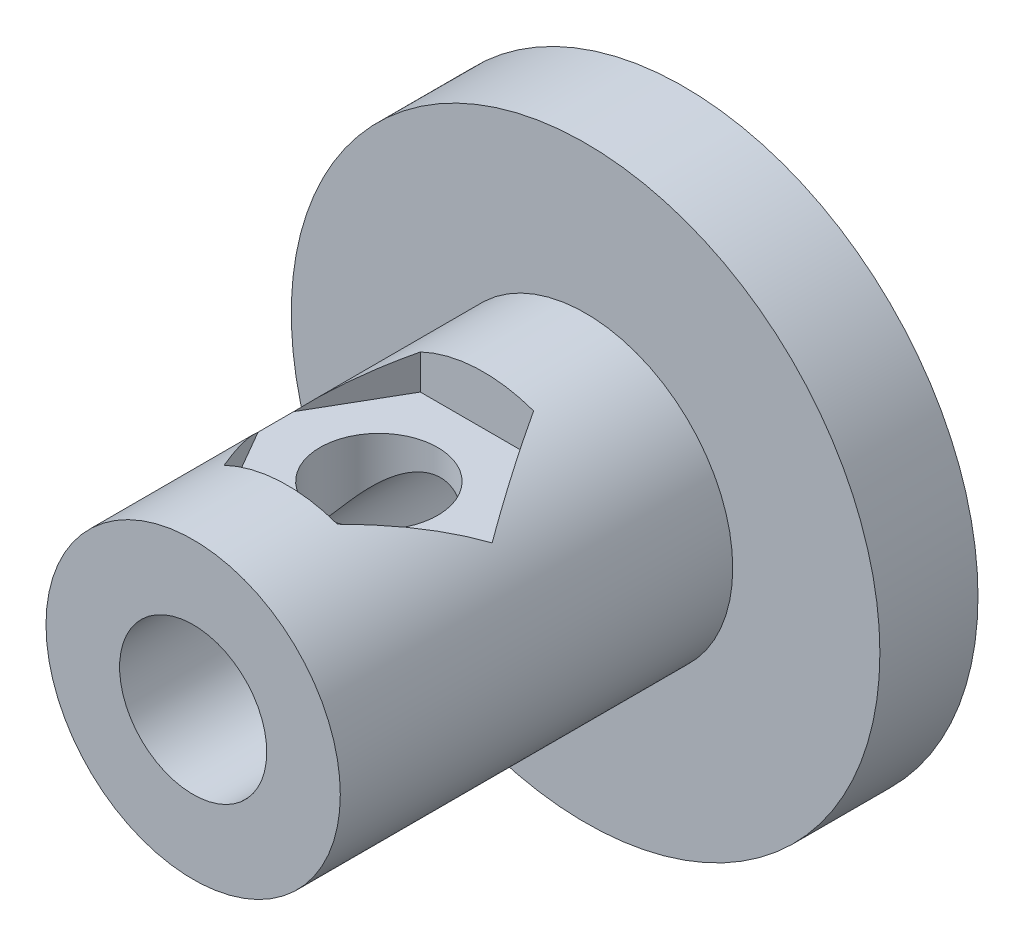
ISO-10303-21;
HEADER;
FILE_DESCRIPTION(('STEP AP214'),'2;1');
FILE_NAME('part.step','',(''),(''),'','','');
FILE_SCHEMA(('AUTOMOTIVE_DESIGN { 1 0 10303 214 1 1 1 1 }'));
ENDSEC;
DATA;
#1=APPLICATION_CONTEXT('core data for automotive mechanical design processes');
#2=APPLICATION_PROTOCOL_DEFINITION('international standard','automotive_design',2000,#1);
#3=PRODUCT_CONTEXT('',#1,'mechanical');
#4=PRODUCT('Part','Part','',(#3));
#5=PRODUCT_RELATED_PRODUCT_CATEGORY('part','',(#4));
#6=PRODUCT_DEFINITION_FORMATION('','',#4);
#7=PRODUCT_DEFINITION_CONTEXT('part definition',#1,'design');
#8=PRODUCT_DEFINITION('design','',#6,#7);
#9=PRODUCT_DEFINITION_SHAPE('','',#8);
#10=(LENGTH_UNIT() NAMED_UNIT(*) SI_UNIT(.MILLI.,.METRE.));
#11=(NAMED_UNIT(*) PLANE_ANGLE_UNIT() SI_UNIT($,.RADIAN.));
#12=(NAMED_UNIT(*) SI_UNIT($,.STERADIAN.) SOLID_ANGLE_UNIT());
#13=UNCERTAINTY_MEASURE_WITH_UNIT(LENGTH_MEASURE(1.E-05),#10,'distance_accuracy_value','');
#14=(GEOMETRIC_REPRESENTATION_CONTEXT(3) GLOBAL_UNCERTAINTY_ASSIGNED_CONTEXT((#13)) GLOBAL_UNIT_ASSIGNED_CONTEXT((#10,
#11,#12)) REPRESENTATION_CONTEXT('',''));
#15=CARTESIAN_POINT('',(0.,0.,0.));
#16=DIRECTION('',(0.,0.,1.));
#17=DIRECTION('',(1.,0.,0.));
#18=AXIS2_PLACEMENT_3D('',#15,#16,#17);
#19=CARTESIAN_POINT('',(-0.135733681298919,-6.001,6.07836587743603));
#20=DIRECTION('',(0.,1.,0.));
#21=DIRECTION('',(0.,0.,1.));
#22=AXIS2_PLACEMENT_3D('',#19,#20,#21);
#23=CYLINDRICAL_SURFACE('',#22,1.2);
#24=CARTESIAN_POINT('',(-0.135733681298919,1.4938461660295,7.27836587743603));
#25=CARTESIAN_POINT('',(-0.0796270431611258,1.49894260178293,7.27836417352178));
#26=CARTESIAN_POINT('',(-0.0232163721366961,1.50085628885863,7.27440524520705));
#27=CARTESIAN_POINT('',(0.0883573269891862,1.49843640460588,7.25860402794741));
#28=CARTESIAN_POINT('',(0.143519773244522,1.4940999784002,7.24675813778859));
#29=CARTESIAN_POINT('',(0.250718408704075,1.47988325647148,7.21580018480276));
#30=CARTESIAN_POINT('',(0.302767028580177,1.47002689581702,7.19671960700027));
#31=CARTESIAN_POINT('',(0.402864810686515,1.44580638299001,7.15210638672446));
#32=CARTESIAN_POINT('',(0.450912884782622,1.43144100941717,7.12657199640943));
#33=CARTESIAN_POINT('',(0.545502314233019,1.39825299314072,7.06792521180374));
#34=CARTESIAN_POINT('',(0.591706997881074,1.37918999749919,7.03440954745417));
#35=CARTESIAN_POINT('',(0.678358642116099,1.33870133167904,6.96179930978559));
#36=CARTESIAN_POINT('',(0.718800005092257,1.31727339991542,6.92269938555684));
#37=CARTESIAN_POINT('',(0.801168646307639,1.26918542192973,6.83118121998646));
#38=CARTESIAN_POINT('',(0.841769238515165,1.2423374847902,6.77766430015797));
#39=CARTESIAN_POINT('',(0.913818606114568,1.19033826866163,6.6639982651824));
#40=CARTESIAN_POINT('',(0.945269302764588,1.16518663434304,6.60385054600668));
#41=CARTESIAN_POINT('',(0.991706748077785,1.12570626065198,6.49258986852545));
#42=CARTESIAN_POINT('',(1.0088341465741,1.11022957091165,6.4427857967973));
#43=CARTESIAN_POINT('',(1.03656183262505,1.08439005004334,6.34016021455954));
#44=CARTESIAN_POINT('',(1.04717602195245,1.07401633659945,6.28734539555484));
#45=CARTESIAN_POINT('',(1.06126234052719,1.06010827064272,6.17930385385326));
#46=CARTESIAN_POINT('',(1.06466539077231,1.05664008842768,6.12405893261371));
#47=CARTESIAN_POINT('',(1.06379216795507,1.057518945483,6.01368935658569));
#48=CARTESIAN_POINT('',(1.05951549115051,1.06186639564046,5.95856470827281));
#49=CARTESIAN_POINT('',(1.04468713562459,1.07643569498428,5.85723285866862));
#50=CARTESIAN_POINT('',(1.03498856327851,1.08585350678512,5.81077356628107));
#51=CARTESIAN_POINT('',(1.0105347559388,1.10864742752818,5.72021528193841));
#52=CARTESIAN_POINT('',(0.995774301917683,1.12202761991209,5.67611878060006));
#53=CARTESIAN_POINT('',(0.95272557018395,1.15908637799158,5.56829203053582));
#54=CARTESIAN_POINT('',(0.921400399034858,1.18448968147715,5.50636531939323));
#55=CARTESIAN_POINT('',(0.849121760624869,1.2373384120762,5.38930385475464));
#56=CARTESIAN_POINT('',(0.808147995358256,1.26478805977987,5.33418379844793));
#57=CARTESIAN_POINT('',(0.716363254925671,1.3189817195393,5.2305486170724));
#58=CARTESIAN_POINT('',(0.665405876424545,1.3457075075952,5.18215278850357));
#59=CARTESIAN_POINT('',(0.55462367402599,1.39500917933499,5.09430317677244));
#60=CARTESIAN_POINT('',(0.494818886351214,1.41759418812971,5.05482968544402));
#61=CARTESIAN_POINT('',(0.382425092871546,1.45132312201442,4.99459289271979));
#62=CARTESIAN_POINT('',(0.331457729004935,1.46390901102652,4.97161252934724));
#63=CARTESIAN_POINT('',(0.225900603413754,1.48386162132401,4.93277645022079));
#64=CARTESIAN_POINT('',(0.171313482052747,1.4912321020697,4.9169156054748));
#65=CARTESIAN_POINT('',(0.0596908357925977,1.4998608502241,4.89300506578695));
#66=CARTESIAN_POINT('',(0.00264505945625973,1.50109038773345,4.88499222717047));
#67=CARTESIAN_POINT('',(-0.111765704155303,1.49692440306144,4.87723675182094));
#68=CARTESIAN_POINT('',(-0.169130650460284,1.49152971251995,4.87749307703638));
#69=CARTESIAN_POINT('',(-0.278011062182345,1.47496344063762,4.88567320688333));
#70=CARTESIAN_POINT('',(-0.329643237476096,1.46425384581075,4.89302241090054));
#71=CARTESIAN_POINT('',(-0.43030434055141,1.43789702554554,4.91394614729815));
#72=CARTESIAN_POINT('',(-0.479332503680097,1.42224835904074,4.92752249708934));
#73=CARTESIAN_POINT('',(-0.577316025997088,1.38551003446642,4.96127988090196));
#74=CARTESIAN_POINT('',(-0.626013982099224,1.36411064478783,4.98186476453753));
#75=CARTESIAN_POINT('',(-0.718844074564227,1.31755988089075,5.02828076548914));
#76=CARTESIAN_POINT('',(-0.762975785621773,1.2924081577074,5.05411237082813));
#77=CARTESIAN_POINT('',(-0.868003450948302,1.22563752055711,5.12464034201224));
#78=CARTESIAN_POINT('',(-0.92583016457828,1.18220820883773,5.17220141351824));
#79=CARTESIAN_POINT('',(-1.03083420045933,1.09187723928378,5.27569699116082));
#80=CARTESIAN_POINT('',(-1.07795308493423,1.04495829861463,5.33167480009543));
#81=CARTESIAN_POINT('',(-1.14101506862213,0.974226860610161,5.42201736250707));
#82=CARTESIAN_POINT('',(-1.16094851101259,0.950315497692979,5.45359324685305));
#83=CARTESIAN_POINT('',(-1.19800171895747,0.903155249523484,5.51890234746066));
#84=CARTESIAN_POINT('',(-1.21511877142524,0.879907020693438,5.55263760094507));
#85=CARTESIAN_POINT('',(-1.24630906813862,0.835136137128139,5.62222188103002));
#86=CARTESIAN_POINT('',(-1.26040198523268,0.813602940688974,5.6580551874583));
#87=CARTESIAN_POINT('',(-1.28542308236089,0.773461878103975,5.73232348819905));
#88=CARTESIAN_POINT('',(-1.29635872829753,0.754847159200216,5.77075207529759));
#89=CARTESIAN_POINT('',(-1.31274680642724,0.725889600112298,5.84236317610499));
#90=CARTESIAN_POINT('',(-1.31886311081675,0.714633707072689,5.87501259358002));
#91=CARTESIAN_POINT('',(-1.32842162734975,0.696707322498565,5.94187826889562));
#92=CARTESIAN_POINT('',(-1.33187224496555,0.690022425373426,5.97608923845027));
#93=CARTESIAN_POINT('',(-1.33579863875836,0.68239592518046,6.04570285109911));
#94=CARTESIAN_POINT('',(-1.33624465053454,0.681511788173277,6.08111393456347));
#95=CARTESIAN_POINT('',(-1.33402329964372,0.685846638759108,6.15148450371083));
#96=CARTESIAN_POINT('',(-1.33135120974466,0.691074893132335,6.1864432222515));
#97=CARTESIAN_POINT('',(-1.32227609115182,0.708305061750922,6.26247869524771));
#98=CARTESIAN_POINT('',(-1.31517167803116,0.721561468821169,6.3031728215692));
#99=CARTESIAN_POINT('',(-1.29743342777126,0.752987459807567,6.38183361836803));
#100=CARTESIAN_POINT('',(-1.28678694240539,0.771174606967282,6.41978991275483));
#101=CARTESIAN_POINT('',(-1.26352589739018,0.808669767504328,6.48985312631392));
#102=CARTESIAN_POINT('',(-1.25116958900284,0.827735359579544,6.52218027507247));
#103=CARTESIAN_POINT('',(-1.22410014151474,0.867268998226592,6.58494883094347));
#104=CARTESIAN_POINT('',(-1.20938514153056,0.887738144771652,6.61538872259336));
#105=CARTESIAN_POINT('',(-1.1618098284645,0.95022472805594,6.70422174962459));
#106=CARTESIAN_POINT('',(-1.12553538296812,0.993293515692343,6.76008105052399));
#107=CARTESIAN_POINT('',(-1.04071884282956,1.08212667062918,6.86967837879692));
#108=CARTESIAN_POINT('',(-0.991423911761685,1.12782869920005,6.92288304173039));
#109=CARTESIAN_POINT('',(-0.882110962947404,1.21521785374912,7.02085173115078));
#110=CARTESIAN_POINT('',(-0.822117345386032,1.25691379013442,7.06563449746782));
#111=CARTESIAN_POINT('',(-0.708722825413131,1.32318688974125,7.13422797985752));
#112=CARTESIAN_POINT('',(-0.657734064304827,1.34938293164666,7.1604571453039));
#113=CARTESIAN_POINT('',(-0.550483352948301,1.39656147977492,7.20591244590148));
#114=CARTESIAN_POINT('',(-0.49422856555008,1.41755093006184,7.22514792470701));
#115=CARTESIAN_POINT('',(-0.387979522565712,1.44982172431515,7.25259885078811));
#116=CARTESIAN_POINT('',(-0.338659009255695,1.46216700855893,7.26216814021328));
#117=CARTESIAN_POINT('',(-0.238221509244758,1.48184536730209,7.27505154906439));
#118=CARTESIAN_POINT('',(-0.187105034780941,1.48917985895289,7.27836743754343));
#119=CARTESIAN_POINT('',(-0.135733681298919,1.4938461660295,7.27836587743603));
#120=B_SPLINE_CURVE_WITH_KNOTS('',3,(#24,#25,#26,#27,#28,#29,#30,#31,#32,#33,#34,#35,#36,#37,
#38,#39,#40,#41,#42,#43,#44,#45,#46,#47,#48,#49,#50,#51,#52,#53,#54,#55,#56,#57,#58,#59,#60,#61,
#62,#63,#64,#65,#66,#67,#68,#69,#70,#71,#72,#73,#74,#75,#76,#77,#78,#79,#80,#81,#82,#83,#84,#85,
#86,#87,#88,#89,#90,#91,#92,#93,#94,#95,#96,#97,#98,#99,#100,#101,#102,#103,#104,#105,#106,#107,
#108,#109,#110,#111,#112,#113,#114,#115,#116,#117,#118,#119),.UNSPECIFIED.,.T.,.F.,(4,2,2,2,2,2,
2,2,2,2,2,2,2,2,2,2,2,2,2,2,2,2,2,2,2,2,2,2,2,2,2,2,2,2,2,2,2,2,2,2,2,2,2,2,2,2,2,4),(0.,
0.168808448998161,0.337694029423268,0.505852910156556,0.674057381093598,0.853949402275628,
1.03401496944917,1.25016973454753,1.46627907952832,1.63038386312898,1.79413715247798,
1.95945215178255,2.12477584235894,2.26939112600298,2.41415596503878,2.63468914918182,
2.85569048624793,3.08021481703249,3.30423825085427,3.47545960433326,3.64655740901309,
3.81845493581203,3.99033088391222,4.14935856300244,4.30843268434886,4.47891543514866,
4.6494140506411,4.90770752421676,5.16737847525468,5.30028864326812,5.43332610613511,
5.56546996216516,5.6972987332417,5.8021833180028,5.90673581415467,6.01232253056436,
6.11806953106349,6.24749254772327,6.37738276626667,6.49575442270615,6.61421993201337,
6.85132049756415,7.10752087428722,7.36314424575934,7.5515762957866,7.73975566500928,
7.89436077223614,8.04892213595462),.UNSPECIFIED.);
#121=CARTESIAN_POINT('',(-0.135733681298919,1.4938461660295,7.27836587743603));
#122=VERTEX_POINT('',#121);
#123=EDGE_CURVE('E132',#122,#122,#120,.T.);
#124=ORIENTED_EDGE('',*,*,#123,.F.);
#125=EDGE_LOOP('',(#124));
#126=FACE_BOUND('',#125,.T.);
#127=CARTESIAN_POINT('',(-0.135733681298919,2.,6.07836587743603));
#128=DIRECTION('',(0.,1.,0.));
#129=DIRECTION('',(0.,0.,1.));
#130=AXIS2_PLACEMENT_3D('',#127,#128,#129);
#131=CIRCLE('',#130,1.2);
#132=CARTESIAN_POINT('',(-0.135733681298919,2.,7.27836587743603));
#133=VERTEX_POINT('',#132);
#134=EDGE_CURVE('E112',#133,#133,#131,.T.);
#135=ORIENTED_EDGE('',*,*,#134,.T.);
#136=EDGE_LOOP('',(#135));
#137=FACE_BOUND('',#136,.T.);
#138=ADVANCED_FACE('F35',(#126,#137),#23,.F.);
#139=CARTESIAN_POINT('',(0.,0.,2.));
#140=DIRECTION('',(0.,0.,1.));
#141=DIRECTION('',(1.,0.,0.));
#142=AXIS2_PLACEMENT_3D('',#139,#140,#141);
#143=PLANE('',#142);
#144=CARTESIAN_POINT('',(0.,0.,2.));
#145=DIRECTION('',(0.,0.,1.));
#146=DIRECTION('',(1.,0.,0.));
#147=AXIS2_PLACEMENT_3D('',#144,#145,#146);
#148=CIRCLE('',#147,6.);
#149=CARTESIAN_POINT('',(6.,0.,2.));
#150=VERTEX_POINT('',#149);
#151=EDGE_CURVE('E284',#150,#150,#148,.T.);
#152=ORIENTED_EDGE('',*,*,#151,.T.);
#153=EDGE_LOOP('',(#152));
#154=FACE_BOUND('',#153,.T.);
#155=CARTESIAN_POINT('',(0.,0.,2.));
#156=DIRECTION('',(0.,0.,1.));
#157=DIRECTION('',(1.,0.,0.));
#158=AXIS2_PLACEMENT_3D('',#155,#156,#157);
#159=CIRCLE('',#158,3.);
#160=CARTESIAN_POINT('',(3.,0.,2.));
#161=VERTEX_POINT('',#160);
#162=EDGE_CURVE('E303',#161,#161,#159,.T.);
#163=ORIENTED_EDGE('',*,*,#162,.F.);
#164=EDGE_LOOP('',(#163));
#165=FACE_BOUND('',#164,.T.);
#166=ADVANCED_FACE('F157',(#154,#165),#143,.T.);
#167=CARTESIAN_POINT('',(0.,0.,0.));
#168=DIRECTION('',(0.,0.,1.));
#169=DIRECTION('',(1.,0.,0.));
#170=AXIS2_PLACEMENT_3D('',#167,#168,#169);
#171=PLANE('',#170);
#172=CARTESIAN_POINT('',(0.,0.,0.));
#173=DIRECTION('',(0.,0.,1.));
#174=DIRECTION('',(1.,0.,0.));
#175=AXIS2_PLACEMENT_3D('',#172,#173,#174);
#176=CIRCLE('',#175,6.);
#177=CARTESIAN_POINT('',(6.,0.,0.));
#178=VERTEX_POINT('',#177);
#179=EDGE_CURVE('E294',#178,#178,#176,.T.);
#180=ORIENTED_EDGE('',*,*,#179,.F.);
#181=EDGE_LOOP('',(#180));
#182=FACE_BOUND('',#181,.T.);
#183=CARTESIAN_POINT('',(0.,0.,0.));
#184=DIRECTION('',(0.,0.,1.));
#185=DIRECTION('',(1.,0.,0.));
#186=AXIS2_PLACEMENT_3D('',#183,#184,#185);
#187=CIRCLE('',#186,1.5);
#188=CARTESIAN_POINT('',(1.5,0.,0.));
#189=VERTEX_POINT('',#188);
#190=EDGE_CURVE('E297',#189,#189,#187,.T.);
#191=ORIENTED_EDGE('',*,*,#190,.T.);
#192=EDGE_LOOP('',(#191));
#193=FACE_BOUND('',#192,.T.);
#194=ADVANCED_FACE('F159',(#182,#193),#171,.F.);
#195=CARTESIAN_POINT('',(0.,0.,2.));
#196=DIRECTION('',(0.,0.,-1.));
#197=DIRECTION('',(-1.,0.,0.));
#198=AXIS2_PLACEMENT_3D('',#195,#196,#197);
#199=CYLINDRICAL_SURFACE('',#198,6.);
#200=ORIENTED_EDGE('',*,*,#151,.F.);
#201=EDGE_LOOP('',(#200));
#202=FACE_BOUND('',#201,.T.);
#203=ORIENTED_EDGE('',*,*,#179,.T.);
#204=EDGE_LOOP('',(#203));
#205=FACE_BOUND('',#204,.T.);
#206=ADVANCED_FACE('F37',(#202,#205),#199,.T.);
#207=CARTESIAN_POINT('',(0.,0.,2.));
#208=DIRECTION('',(0.,0.,-1.));
#209=DIRECTION('',(-1.,0.,0.));
#210=AXIS2_PLACEMENT_3D('',#207,#208,#209);
#211=CYLINDRICAL_SURFACE('',#210,1.5);
#212=ORIENTED_EDGE('',*,*,#123,.T.);
#213=EDGE_LOOP('',(#212));
#214=FACE_BOUND('',#213,.T.);
#215=ORIENTED_EDGE('',*,*,#190,.F.);
#216=EDGE_LOOP('',(#215));
#217=FACE_BOUND('',#216,.T.);
#218=CARTESIAN_POINT('',(0.,0.,10.));
#219=DIRECTION('',(0.,0.,1.));
#220=DIRECTION('',(1.,0.,0.));
#221=AXIS2_PLACEMENT_3D('',#218,#219,#220);
#222=CIRCLE('',#221,1.5);
#223=CARTESIAN_POINT('',(1.5,0.,10.));
#224=VERTEX_POINT('',#223);
#225=EDGE_CURVE('E139',#224,#224,#222,.T.);
#226=ORIENTED_EDGE('',*,*,#225,.T.);
#227=EDGE_LOOP('',(#226));
#228=FACE_BOUND('',#227,.T.);
#229=ADVANCED_FACE('F149',(#214,#217,#228),#211,.F.);
#230=CARTESIAN_POINT('',(0.,0.,10.));
#231=DIRECTION('',(0.,0.,1.));
#232=DIRECTION('',(1.,0.,0.));
#233=AXIS2_PLACEMENT_3D('',#230,#231,#232);
#234=PLANE('',#233);
#235=CARTESIAN_POINT('',(0.,0.,10.));
#236=DIRECTION('',(0.,0.,1.));
#237=DIRECTION('',(1.,0.,0.));
#238=AXIS2_PLACEMENT_3D('',#235,#236,#237);
#239=CIRCLE('',#238,3.);
#240=CARTESIAN_POINT('',(3.,0.,10.));
#241=VERTEX_POINT('',#240);
#242=EDGE_CURVE('E302',#241,#241,#239,.T.);
#243=ORIENTED_EDGE('',*,*,#242,.T.);
#244=EDGE_LOOP('',(#243));
#245=FACE_BOUND('',#244,.T.);
#246=ORIENTED_EDGE('',*,*,#225,.F.);
#247=EDGE_LOOP('',(#246));
#248=FACE_BOUND('',#247,.T.);
#249=ADVANCED_FACE('F145',(#245,#248),#234,.T.);
#250=CARTESIAN_POINT('',(0.,0.,10.));
#251=DIRECTION('',(0.,0.,-1.));
#252=DIRECTION('',(-1.,0.,0.));
#253=AXIS2_PLACEMENT_3D('',#250,#251,#252);
#254=CYLINDRICAL_SURFACE('',#253,3.);
#255=CARTESIAN_POINT('',(0.,0.,1.84326824512794));
#256=DIRECTION('',(-0.866025403784439,0.,-0.5));
#257=DIRECTION('',(0.5,0.,-0.866025403784439));
#258=AXIS2_PLACEMENT_3D('',#255,#256,#257);
#259=ELLIPSE('',#258,6.00000000000001,3.);
#260=CARTESIAN_POINT('',(-2.23606797749979,2.,5.71625159133536));
#261=VERTEX_POINT('',#260);
#262=CARTESIAN_POINT('',(-1.29043421967817,2.70827980915628,4.07836587743603));
#263=VERTEX_POINT('',#262);
#264=EDGE_CURVE('E281',#261,#263,#259,.T.);
#265=ORIENTED_EDGE('',*,*,#264,.T.);
#266=CARTESIAN_POINT('',(0.,0.,4.07836587743603));
#267=DIRECTION('',(0.,0.,-1.));
#268=DIRECTION('',(-1.,0.,0.));
#269=AXIS2_PLACEMENT_3D('',#266,#267,#268);
#270=CIRCLE('',#269,3.);
#271=CARTESIAN_POINT('',(1.01896685708033,2.82164961399743,4.07836587743603));
#272=VERTEX_POINT('',#271);
#273=EDGE_CURVE('E11',#263,#272,#270,.T.);
#274=ORIENTED_EDGE('',*,*,#273,.T.);
#275=CARTESIAN_POINT('',(0.,0.,2.31346350974412));
#276=DIRECTION('',(0.866025403784439,0.,-0.5));
#277=DIRECTION('',(-0.5,0.,-0.866025403784439));
#278=AXIS2_PLACEMENT_3D('',#275,#276,#277);
#279=ELLIPSE('',#278,6.,3.);
#280=CARTESIAN_POINT('',(2.17366739545958,2.06764843576367,6.07836587743603));
#281=VERTEX_POINT('',#280);
#282=EDGE_CURVE('E43',#272,#281,#279,.T.);
#283=ORIENTED_EDGE('',*,*,#282,.T.);
#284=CARTESIAN_POINT('',(0.,0.,9.84326824512794));
#285=DIRECTION('',(0.866025403784439,0.,0.499999999999999));
#286=DIRECTION('',(0.5,0.,-0.866025403784439));
#287=AXIS2_PLACEMENT_3D('',#284,#285,#286);
#288=ELLIPSE('',#287,6.00000000000001,3.);
#289=CARTESIAN_POINT('',(1.01896685708033,2.82164961399743,8.07836587743603));
#290=VERTEX_POINT('',#289);
#291=EDGE_CURVE('E97',#281,#290,#288,.T.);
#292=ORIENTED_EDGE('',*,*,#291,.T.);
#293=CARTESIAN_POINT('',(0.,0.,8.07836587743603));
#294=DIRECTION('',(0.,0.,1.));
#295=DIRECTION('',(1.,0.,0.));
#296=AXIS2_PLACEMENT_3D('',#293,#294,#295);
#297=CIRCLE('',#296,3.);
#298=CARTESIAN_POINT('',(-1.29043421967817,2.70827980915628,8.07836587743603));
#299=VERTEX_POINT('',#298);
#300=EDGE_CURVE('E58',#290,#299,#297,.T.);
#301=ORIENTED_EDGE('',*,*,#300,.T.);
#302=CARTESIAN_POINT('',(0.,0.,10.3134635097441));
#303=DIRECTION('',(-0.866025403784439,0.,0.5));
#304=DIRECTION('',(-0.5,0.,-0.866025403784439));
#305=AXIS2_PLACEMENT_3D('',#302,#303,#304);
#306=ELLIPSE('',#305,6.,3.);
#307=CARTESIAN_POINT('',(-2.23606797749979,2.,6.4404801635367));
#308=VERTEX_POINT('',#307);
#309=EDGE_CURVE('E283',#299,#308,#306,.T.);
#310=ORIENTED_EDGE('',*,*,#309,.T.);
#311=DIRECTION('',(0.,0.,-1.));
#312=VECTOR('',#311,1.);
#313=CARTESIAN_POINT('',(-2.23606797749979,2.,10.));
#314=LINE('',#313,#312);
#315=EDGE_CURVE('E124',#261,#308,#314,.F.);
#316=ORIENTED_EDGE('',*,*,#315,.F.);
#317=EDGE_LOOP('',(#265,#274,#283,#292,#301,#310,#316));
#318=FACE_BOUND('',#317,.T.);
#319=ORIENTED_EDGE('',*,*,#242,.F.);
#320=EDGE_LOOP('',(#319));
#321=FACE_BOUND('',#320,.T.);
#322=ORIENTED_EDGE('',*,*,#162,.T.);
#323=EDGE_LOOP('',(#322));
#324=FACE_BOUND('',#323,.T.);
#325=ADVANCED_FACE('F148',(#318,#321,#324),#254,.T.);
#326=CARTESIAN_POINT('',(1.01896685708033,2.,8.07836587743603));
#327=DIRECTION('',(0.866025403784439,0.,0.499999999999999));
#328=DIRECTION('',(0.5,0.,-0.866025403784439));
#329=AXIS2_PLACEMENT_3D('',#326,#327,#328);
#330=PLANE('',#329);
#331=DIRECTION('',(0.,1.,0.));
#332=VECTOR('',#331,1.);
#333=CARTESIAN_POINT('',(2.17366739545958,2.,6.07836587743603));
#334=LINE('',#333,#332);
#335=CARTESIAN_POINT('',(2.17366739545958,2.,6.07836587743603));
#336=VERTEX_POINT('',#335);
#337=EDGE_CURVE('E90',#336,#281,#334,.T.);
#338=ORIENTED_EDGE('',*,*,#337,.F.);
#339=DIRECTION('',(0.499999999999999,0.,-0.866025403784439));
#340=VECTOR('',#339,1.);
#341=CARTESIAN_POINT('',(1.01896685708033,2.,8.07836587743603));
#342=LINE('',#341,#340);
#343=CARTESIAN_POINT('',(1.01896685708033,2.,8.07836587743603));
#344=VERTEX_POINT('',#343);
#345=EDGE_CURVE('E94',#344,#336,#342,.T.);
#346=ORIENTED_EDGE('',*,*,#345,.F.);
#347=DIRECTION('',(0.,1.,0.));
#348=VECTOR('',#347,1.);
#349=CARTESIAN_POINT('',(1.01896685708033,2.,8.07836587743603));
#350=LINE('',#349,#348);
#351=EDGE_CURVE('E122',#344,#290,#350,.T.);
#352=ORIENTED_EDGE('',*,*,#351,.T.);
#353=ORIENTED_EDGE('',*,*,#291,.F.);
#354=EDGE_LOOP('',(#338,#346,#352,#353));
#355=FACE_BOUND('',#354,.T.);
#356=ADVANCED_FACE('F92',(#355),#330,.F.);
#357=CARTESIAN_POINT('',(-1.29043421967817,2.,8.07836587743603));
#358=DIRECTION('',(0.,0.,1.));
#359=DIRECTION('',(1.,0.,0.));
#360=AXIS2_PLACEMENT_3D('',#357,#358,#359);
#361=PLANE('',#360);
#362=ORIENTED_EDGE('',*,*,#351,.F.);
#363=DIRECTION('',(1.,0.,0.));
#364=VECTOR('',#363,1.);
#365=CARTESIAN_POINT('',(-1.29043421967817,2.,8.07836587743603));
#366=LINE('',#365,#364);
#367=CARTESIAN_POINT('',(-1.29043421967817,2.,8.07836587743603));
#368=VERTEX_POINT('',#367);
#369=EDGE_CURVE('E101',#368,#344,#366,.T.);
#370=ORIENTED_EDGE('',*,*,#369,.F.);
#371=DIRECTION('',(0.,1.,0.));
#372=VECTOR('',#371,1.);
#373=CARTESIAN_POINT('',(-1.29043421967817,2.,8.07836587743603));
#374=LINE('',#373,#372);
#375=EDGE_CURVE('E125',#368,#299,#374,.T.);
#376=ORIENTED_EDGE('',*,*,#375,.T.);
#377=ORIENTED_EDGE('',*,*,#300,.F.);
#378=EDGE_LOOP('',(#362,#370,#376,#377));
#379=FACE_BOUND('',#378,.T.);
#380=ADVANCED_FACE('F185',(#379),#361,.F.);
#381=CARTESIAN_POINT('',(-2.44513475805742,2.,6.07836587743603));
#382=DIRECTION('',(-0.866025403784439,0.,0.5));
#383=DIRECTION('',(0.5,0.,0.866025403784439));
#384=AXIS2_PLACEMENT_3D('',#381,#382,#383);
#385=PLANE('',#384);
#386=ORIENTED_EDGE('',*,*,#375,.F.);
#387=DIRECTION('',(0.5,0.,0.866025403784439));
#388=VECTOR('',#387,1.);
#389=CARTESIAN_POINT('',(-2.44513475805742,2.,6.07836587743603));
#390=LINE('',#389,#388);
#391=EDGE_CURVE('E119',#308,#368,#390,.T.);
#392=ORIENTED_EDGE('',*,*,#391,.F.);
#393=ORIENTED_EDGE('',*,*,#309,.F.);
#394=EDGE_LOOP('',(#386,#392,#393));
#395=FACE_BOUND('',#394,.T.);
#396=ADVANCED_FACE('F188',(#395),#385,.F.);
#397=CARTESIAN_POINT('',(-1.29043421967817,2.,4.07836587743603));
#398=DIRECTION('',(-0.866025403784439,0.,-0.5));
#399=DIRECTION('',(-0.5,0.,0.866025403784439));
#400=AXIS2_PLACEMENT_3D('',#397,#398,#399);
#401=PLANE('',#400);
#402=DIRECTION('',(-0.5,0.,0.866025403784439));
#403=VECTOR('',#402,1.);
#404=CARTESIAN_POINT('',(-1.29043421967817,2.,4.07836587743603));
#405=LINE('',#404,#403);
#406=CARTESIAN_POINT('',(-1.29043421967817,2.,4.07836587743603));
#407=VERTEX_POINT('',#406);
#408=EDGE_CURVE('E50',#407,#261,#405,.T.);
#409=ORIENTED_EDGE('',*,*,#408,.F.);
#410=DIRECTION('',(0.,1.,0.));
#411=VECTOR('',#410,1.);
#412=CARTESIAN_POINT('',(-1.29043421967817,2.,4.07836587743603));
#413=LINE('',#412,#411);
#414=EDGE_CURVE('E127',#407,#263,#413,.T.);
#415=ORIENTED_EDGE('',*,*,#414,.T.);
#416=ORIENTED_EDGE('',*,*,#264,.F.);
#417=EDGE_LOOP('',(#409,#415,#416));
#418=FACE_BOUND('',#417,.T.);
#419=ADVANCED_FACE('F191',(#418),#401,.F.);
#420=CARTESIAN_POINT('',(1.01896685708033,2.,4.07836587743603));
#421=DIRECTION('',(0.,0.,-1.));
#422=DIRECTION('',(-1.,0.,0.));
#423=AXIS2_PLACEMENT_3D('',#420,#421,#422);
#424=PLANE('',#423);
#425=ORIENTED_EDGE('',*,*,#414,.F.);
#426=DIRECTION('',(-1.,0.,0.));
#427=VECTOR('',#426,1.);
#428=CARTESIAN_POINT('',(1.01896685708033,2.,4.07836587743603));
#429=LINE('',#428,#427);
#430=CARTESIAN_POINT('',(1.01896685708033,2.,4.07836587743603));
#431=VERTEX_POINT('',#430);
#432=EDGE_CURVE('E108',#431,#407,#429,.T.);
#433=ORIENTED_EDGE('',*,*,#432,.F.);
#434=DIRECTION('',(0.,1.,0.));
#435=VECTOR('',#434,1.);
#436=CARTESIAN_POINT('',(1.01896685708033,2.,4.07836587743603));
#437=LINE('',#436,#435);
#438=EDGE_CURVE('E100',#431,#272,#437,.T.);
#439=ORIENTED_EDGE('',*,*,#438,.T.);
#440=ORIENTED_EDGE('',*,*,#273,.F.);
#441=EDGE_LOOP('',(#425,#433,#439,#440));
#442=FACE_BOUND('',#441,.T.);
#443=ADVANCED_FACE('F182',(#442),#424,.F.);
#444=CARTESIAN_POINT('',(2.17366739545958,2.,6.07836587743603));
#445=DIRECTION('',(0.866025403784439,0.,-0.5));
#446=DIRECTION('',(-0.5,0.,-0.866025403784439));
#447=AXIS2_PLACEMENT_3D('',#444,#445,#446);
#448=PLANE('',#447);
#449=ORIENTED_EDGE('',*,*,#438,.F.);
#450=DIRECTION('',(-0.5,0.,-0.866025403784439));
#451=VECTOR('',#450,1.);
#452=CARTESIAN_POINT('',(2.17366739545958,2.,6.07836587743603));
#453=LINE('',#452,#451);
#454=EDGE_CURVE('E104',#336,#431,#453,.T.);
#455=ORIENTED_EDGE('',*,*,#454,.F.);
#456=ORIENTED_EDGE('',*,*,#337,.T.);
#457=ORIENTED_EDGE('',*,*,#282,.F.);
#458=EDGE_LOOP('',(#449,#455,#456,#457));
#459=FACE_BOUND('',#458,.T.);
#460=ADVANCED_FACE('F105',(#459),#448,.F.);
#461=CARTESIAN_POINT('',(2.17366739545958,2.,6.07836587743603));
#462=DIRECTION('',(0.,1.,0.));
#463=DIRECTION('',(0.,0.,1.));
#464=AXIS2_PLACEMENT_3D('',#461,#462,#463);
#465=PLANE('',#464);
#466=ORIENTED_EDGE('',*,*,#134,.F.);
#467=EDGE_LOOP('',(#466));
#468=FACE_BOUND('',#467,.T.);
#469=ORIENTED_EDGE('',*,*,#315,.T.);
#470=ORIENTED_EDGE('',*,*,#391,.T.);
#471=ORIENTED_EDGE('',*,*,#369,.T.);
#472=ORIENTED_EDGE('',*,*,#345,.T.);
#473=ORIENTED_EDGE('',*,*,#454,.T.);
#474=ORIENTED_EDGE('',*,*,#432,.T.);
#475=ORIENTED_EDGE('',*,*,#408,.T.);
#476=EDGE_LOOP('',(#469,#470,#471,#472,#473,#474,#475));
#477=FACE_BOUND('',#476,.T.);
#478=ADVANCED_FACE('F110',(#468,#477),#465,.T.);
#479=CLOSED_SHELL('',(#138,#166,#194,#206,#229,#249,#325,#356,#380,#396,#419,#443,#460,#478));
#480=MANIFOLD_SOLID_BREP('B2',#479);
#481=ADVANCED_BREP_SHAPE_REPRESENTATION('',(#18,#480),#14);
#482=SHAPE_DEFINITION_REPRESENTATION(#9,#481);
ENDSEC;
END-ISO-10303-21;
